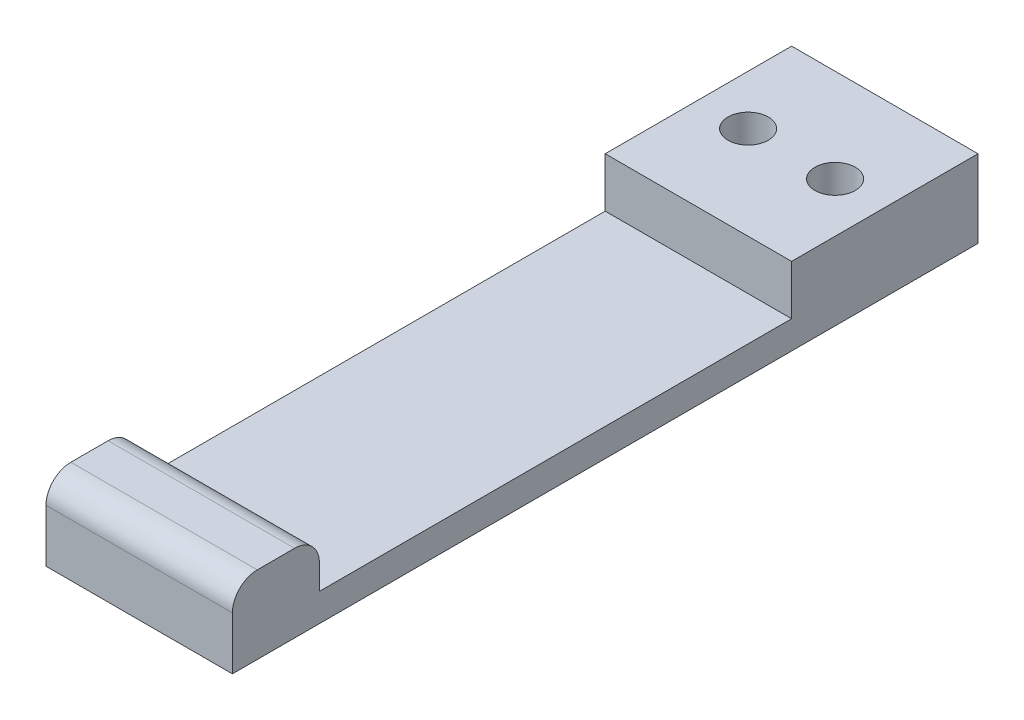
ISO-10303-21;
HEADER;
FILE_DESCRIPTION(('STEP AP214'),'2;1');
FILE_NAME('part.step','',(''),(''),'','','');
FILE_SCHEMA(('AUTOMOTIVE_DESIGN { 1 0 10303 214 1 1 1 1 }'));
ENDSEC;
DATA;
#1=APPLICATION_CONTEXT('core data for automotive mechanical design processes');
#2=APPLICATION_PROTOCOL_DEFINITION('international standard','automotive_design',2000,#1);
#3=PRODUCT_CONTEXT('',#1,'mechanical');
#4=PRODUCT('Part','Part','',(#3));
#5=PRODUCT_RELATED_PRODUCT_CATEGORY('part','',(#4));
#6=PRODUCT_DEFINITION_FORMATION('','',#4);
#7=PRODUCT_DEFINITION_CONTEXT('part definition',#1,'design');
#8=PRODUCT_DEFINITION('design','',#6,#7);
#9=PRODUCT_DEFINITION_SHAPE('','',#8);
#10=(LENGTH_UNIT() NAMED_UNIT(*) SI_UNIT(.MILLI.,.METRE.));
#11=(NAMED_UNIT(*) PLANE_ANGLE_UNIT() SI_UNIT($,.RADIAN.));
#12=(NAMED_UNIT(*) SI_UNIT($,.STERADIAN.) SOLID_ANGLE_UNIT());
#13=UNCERTAINTY_MEASURE_WITH_UNIT(LENGTH_MEASURE(1.E-05),#10,'distance_accuracy_value','');
#14=(GEOMETRIC_REPRESENTATION_CONTEXT(3) GLOBAL_UNCERTAINTY_ASSIGNED_CONTEXT((#13)) GLOBAL_UNIT_ASSIGNED_CONTEXT((#10,
#11,#12)) REPRESENTATION_CONTEXT('',''));
#15=CARTESIAN_POINT('',(0.,0.,0.));
#16=DIRECTION('',(0.,0.,1.));
#17=DIRECTION('',(1.,0.,0.));
#18=AXIS2_PLACEMENT_3D('',#15,#16,#17);
#19=CARTESIAN_POINT('',(15.,0.,-60.));
#20=DIRECTION('',(0.,0.,-1.));
#21=DIRECTION('',(-1.,0.,0.));
#22=AXIS2_PLACEMENT_3D('',#19,#20,#21);
#23=PLANE('',#22);
#24=DIRECTION('',(0.,-1.,0.));
#25=VECTOR('',#24,1.);
#26=CARTESIAN_POINT('',(0.,0.,-60.));
#27=LINE('',#26,#25);
#28=CARTESIAN_POINT('',(0.,6.25,-60.));
#29=VERTEX_POINT('',#28);
#30=CARTESIAN_POINT('',(0.,0.,-60.));
#31=VERTEX_POINT('',#30);
#32=EDGE_CURVE('E160',#29,#31,#27,.T.);
#33=ORIENTED_EDGE('',*,*,#32,.F.);
#34=DIRECTION('',(-1.,0.,0.));
#35=VECTOR('',#34,1.);
#36=CARTESIAN_POINT('',(15.,6.25,-60.));
#37=LINE('',#36,#35);
#38=CARTESIAN_POINT('',(15.,6.25,-60.));
#39=VERTEX_POINT('',#38);
#40=EDGE_CURVE('E11',#39,#29,#37,.T.);
#41=ORIENTED_EDGE('',*,*,#40,.F.);
#42=DIRECTION('',(0.,-1.,0.));
#43=VECTOR('',#42,1.);
#44=CARTESIAN_POINT('',(15.,0.,-60.));
#45=LINE('',#44,#43);
#46=CARTESIAN_POINT('',(15.,0.,-60.));
#47=VERTEX_POINT('',#46);
#48=EDGE_CURVE('E196',#39,#47,#45,.T.);
#49=ORIENTED_EDGE('',*,*,#48,.T.);
#50=DIRECTION('',(-1.,0.,0.));
#51=VECTOR('',#50,1.);
#52=CARTESIAN_POINT('',(15.,0.,-60.));
#53=LINE('',#52,#51);
#54=EDGE_CURVE('E104',#47,#31,#53,.T.);
#55=ORIENTED_EDGE('',*,*,#54,.T.);
#56=EDGE_LOOP('',(#33,#41,#49,#55));
#57=FACE_BOUND('',#56,.T.);
#58=ADVANCED_FACE('F47',(#57),#23,.T.);
#59=CARTESIAN_POINT('',(15.,6.24999999999999,0.));
#60=DIRECTION('',(0.,-1.,0.));
#61=DIRECTION('',(0.,0.,-1.));
#62=AXIS2_PLACEMENT_3D('',#59,#60,#61);
#63=PLANE('',#62);
#64=CARTESIAN_POINT('',(11.,6.25,-52.5));
#65=DIRECTION('',(0.,-1.,0.));
#66=DIRECTION('',(0.,0.,-1.));
#67=AXIS2_PLACEMENT_3D('',#64,#65,#66);
#68=CIRCLE('',#67,1.625);
#69=CARTESIAN_POINT('',(11.,6.25,-54.125));
#70=VERTEX_POINT('',#69);
#71=EDGE_CURVE('E165',#70,#70,#68,.F.);
#72=ORIENTED_EDGE('',*,*,#71,.F.);
#73=EDGE_LOOP('',(#72));
#74=FACE_BOUND('',#73,.T.);
#75=CARTESIAN_POINT('',(4.,6.25,-52.5));
#76=DIRECTION('',(0.,-1.,0.));
#77=DIRECTION('',(0.,0.,-1.));
#78=AXIS2_PLACEMENT_3D('',#75,#76,#77);
#79=CIRCLE('',#78,1.625);
#80=CARTESIAN_POINT('',(4.,6.25,-54.125));
#81=VERTEX_POINT('',#80);
#82=EDGE_CURVE('E265',#81,#81,#79,.F.);
#83=ORIENTED_EDGE('',*,*,#82,.F.);
#84=EDGE_LOOP('',(#83));
#85=FACE_BOUND('',#84,.T.);
#86=DIRECTION('',(0.,0.,1.));
#87=VECTOR('',#86,1.);
#88=CARTESIAN_POINT('',(0.,6.24999999999999,0.));
#89=LINE('',#88,#87);
#90=CARTESIAN_POINT('',(0.,6.25,-45.));
#91=VERTEX_POINT('',#90);
#92=EDGE_CURVE('E164',#29,#91,#89,.T.);
#93=ORIENTED_EDGE('',*,*,#92,.T.);
#94=DIRECTION('',(-1.,0.,0.));
#95=VECTOR('',#94,1.);
#96=CARTESIAN_POINT('',(15.,6.25,-45.));
#97=LINE('',#96,#95);
#98=CARTESIAN_POINT('',(15.,6.25,-45.));
#99=VERTEX_POINT('',#98);
#100=EDGE_CURVE('E56',#99,#91,#97,.T.);
#101=ORIENTED_EDGE('',*,*,#100,.F.);
#102=DIRECTION('',(0.,0.,1.));
#103=VECTOR('',#102,1.);
#104=CARTESIAN_POINT('',(15.,6.24999999999999,0.));
#105=LINE('',#104,#103);
#106=EDGE_CURVE('E235',#39,#99,#105,.T.);
#107=ORIENTED_EDGE('',*,*,#106,.F.);
#108=ORIENTED_EDGE('',*,*,#40,.T.);
#109=EDGE_LOOP('',(#93,#101,#107,#108));
#110=FACE_BOUND('',#109,.T.);
#111=ADVANCED_FACE('F224',(#74,#85,#110),#63,.F.);
#112=CARTESIAN_POINT('',(15.,0.,-45.));
#113=DIRECTION('',(0.,0.,1.));
#114=DIRECTION('',(1.,0.,0.));
#115=AXIS2_PLACEMENT_3D('',#112,#113,#114);
#116=PLANE('',#115);
#117=DIRECTION('',(0.,1.,0.));
#118=VECTOR('',#117,1.);
#119=CARTESIAN_POINT('',(0.,0.,-45.));
#120=LINE('',#119,#118);
#121=CARTESIAN_POINT('',(0.,2.25,-45.));
#122=VERTEX_POINT('',#121);
#123=EDGE_CURVE('E169',#122,#91,#120,.T.);
#124=ORIENTED_EDGE('',*,*,#123,.F.);
#125=DIRECTION('',(-1.,0.,0.));
#126=VECTOR('',#125,1.);
#127=CARTESIAN_POINT('',(15.,2.25,-45.));
#128=LINE('',#127,#126);
#129=CARTESIAN_POINT('',(15.,2.25,-45.));
#130=VERTEX_POINT('',#129);
#131=EDGE_CURVE('E212',#130,#122,#128,.T.);
#132=ORIENTED_EDGE('',*,*,#131,.F.);
#133=DIRECTION('',(0.,1.,0.));
#134=VECTOR('',#133,1.);
#135=CARTESIAN_POINT('',(15.,0.,-45.));
#136=LINE('',#135,#134);
#137=EDGE_CURVE('E221',#130,#99,#136,.T.);
#138=ORIENTED_EDGE('',*,*,#137,.T.);
#139=ORIENTED_EDGE('',*,*,#100,.T.);
#140=EDGE_LOOP('',(#124,#132,#138,#139));
#141=FACE_BOUND('',#140,.T.);
#142=ADVANCED_FACE('F219',(#141),#116,.T.);
#143=CARTESIAN_POINT('',(15.,2.25,0.));
#144=DIRECTION('',(0.,1.,0.));
#145=DIRECTION('',(0.,0.,1.));
#146=AXIS2_PLACEMENT_3D('',#143,#144,#145);
#147=PLANE('',#146);
#148=DIRECTION('',(0.,0.,-1.));
#149=VECTOR('',#148,1.);
#150=CARTESIAN_POINT('',(0.,2.25,0.));
#151=LINE('',#150,#149);
#152=CARTESIAN_POINT('',(0.,2.25,-7.));
#153=VERTEX_POINT('',#152);
#154=EDGE_CURVE('E173',#153,#122,#151,.T.);
#155=ORIENTED_EDGE('',*,*,#154,.F.);
#156=DIRECTION('',(-1.,0.,0.));
#157=VECTOR('',#156,1.);
#158=CARTESIAN_POINT('',(15.,2.25,-7.));
#159=LINE('',#158,#157);
#160=CARTESIAN_POINT('',(15.,2.25,-7.));
#161=VERTEX_POINT('',#160);
#162=EDGE_CURVE('E209',#161,#153,#159,.T.);
#163=ORIENTED_EDGE('',*,*,#162,.F.);
#164=DIRECTION('',(0.,0.,-1.));
#165=VECTOR('',#164,1.);
#166=CARTESIAN_POINT('',(15.,2.25,0.));
#167=LINE('',#166,#165);
#168=EDGE_CURVE('E234',#161,#130,#167,.T.);
#169=ORIENTED_EDGE('',*,*,#168,.T.);
#170=ORIENTED_EDGE('',*,*,#131,.T.);
#171=EDGE_LOOP('',(#155,#163,#169,#170));
#172=FACE_BOUND('',#171,.T.);
#173=ADVANCED_FACE('F230',(#172),#147,.T.);
#174=CARTESIAN_POINT('',(15.,0.,-7.));
#175=DIRECTION('',(0.,0.,1.));
#176=DIRECTION('',(0.,-1.,0.));
#177=AXIS2_PLACEMENT_3D('',#174,#175,#176);
#178=PLANE('',#177);
#179=DIRECTION('',(0.,1.,0.));
#180=VECTOR('',#179,1.);
#181=CARTESIAN_POINT('',(0.,0.,-7.));
#182=LINE('',#181,#180);
#183=CARTESIAN_POINT('',(0.,4.25,-7.));
#184=VERTEX_POINT('',#183);
#185=EDGE_CURVE('E177',#153,#184,#182,.T.);
#186=ORIENTED_EDGE('',*,*,#185,.T.);
#187=DIRECTION('',(-1.,0.,0.));
#188=VECTOR('',#187,1.);
#189=CARTESIAN_POINT('',(15.,4.25,-7.));
#190=LINE('',#189,#188);
#191=CARTESIAN_POINT('',(15.,4.25,-7.));
#192=VERTEX_POINT('',#191);
#193=EDGE_CURVE('E206',#192,#184,#190,.T.);
#194=ORIENTED_EDGE('',*,*,#193,.F.);
#195=DIRECTION('',(0.,1.,0.));
#196=VECTOR('',#195,1.);
#197=CARTESIAN_POINT('',(15.,0.,-7.));
#198=LINE('',#197,#196);
#199=EDGE_CURVE('E240',#161,#192,#198,.T.);
#200=ORIENTED_EDGE('',*,*,#199,.F.);
#201=ORIENTED_EDGE('',*,*,#162,.T.);
#202=EDGE_LOOP('',(#186,#194,#200,#201));
#203=FACE_BOUND('',#202,.T.);
#204=ADVANCED_FACE('F309',(#203),#178,.F.);
#205=CARTESIAN_POINT('',(15.,4.25,-5.));
#206=DIRECTION('',(-1.,0.,0.));
#207=DIRECTION('',(0.,0.,1.));
#208=AXIS2_PLACEMENT_3D('',#205,#206,#207);
#209=CYLINDRICAL_SURFACE('',#208,2.);
#210=CARTESIAN_POINT('',(0.,4.25,-5.));
#211=DIRECTION('',(1.,0.,0.));
#212=DIRECTION('',(0.,0.,-1.));
#213=AXIS2_PLACEMENT_3D('',#210,#211,#212);
#214=CIRCLE('',#213,2.);
#215=CARTESIAN_POINT('',(0.,6.25,-5.));
#216=VERTEX_POINT('',#215);
#217=EDGE_CURVE('E181',#216,#184,#214,.F.);
#218=ORIENTED_EDGE('',*,*,#217,.F.);
#219=DIRECTION('',(-1.,0.,0.));
#220=VECTOR('',#219,1.);
#221=CARTESIAN_POINT('',(15.,6.25,-5.));
#222=LINE('',#221,#220);
#223=CARTESIAN_POINT('',(15.,6.25,-5.));
#224=VERTEX_POINT('',#223);
#225=EDGE_CURVE('E203',#224,#216,#222,.T.);
#226=ORIENTED_EDGE('',*,*,#225,.F.);
#227=CARTESIAN_POINT('',(15.,4.25,-5.));
#228=DIRECTION('',(1.,0.,0.));
#229=DIRECTION('',(0.,0.,-1.));
#230=AXIS2_PLACEMENT_3D('',#227,#228,#229);
#231=CIRCLE('',#230,2.);
#232=EDGE_CURVE('E154',#224,#192,#231,.F.);
#233=ORIENTED_EDGE('',*,*,#232,.T.);
#234=ORIENTED_EDGE('',*,*,#193,.T.);
#235=EDGE_LOOP('',(#218,#226,#233,#234));
#236=FACE_BOUND('',#235,.T.);
#237=ADVANCED_FACE('F250',(#236),#209,.T.);
#238=CARTESIAN_POINT('',(15.,6.25,0.));
#239=DIRECTION('',(0.,1.,0.));
#240=DIRECTION('',(0.,0.,1.));
#241=AXIS2_PLACEMENT_3D('',#238,#239,#240);
#242=PLANE('',#241);
#243=DIRECTION('',(0.,0.,-1.));
#244=VECTOR('',#243,1.);
#245=CARTESIAN_POINT('',(0.,6.25,0.));
#246=LINE('',#245,#244);
#247=CARTESIAN_POINT('',(0.,6.25,-2.));
#248=VERTEX_POINT('',#247);
#249=EDGE_CURVE('E185',#248,#216,#246,.T.);
#250=ORIENTED_EDGE('',*,*,#249,.F.);
#251=DIRECTION('',(-1.,0.,0.));
#252=VECTOR('',#251,1.);
#253=CARTESIAN_POINT('',(15.,6.25,-2.));
#254=LINE('',#253,#252);
#255=CARTESIAN_POINT('',(15.,6.25,-2.));
#256=VERTEX_POINT('',#255);
#257=EDGE_CURVE('E139',#256,#248,#254,.T.);
#258=ORIENTED_EDGE('',*,*,#257,.F.);
#259=DIRECTION('',(0.,0.,-1.));
#260=VECTOR('',#259,1.);
#261=CARTESIAN_POINT('',(15.,6.25,0.));
#262=LINE('',#261,#260);
#263=EDGE_CURVE('E150',#256,#224,#262,.T.);
#264=ORIENTED_EDGE('',*,*,#263,.T.);
#265=ORIENTED_EDGE('',*,*,#225,.T.);
#266=EDGE_LOOP('',(#250,#258,#264,#265));
#267=FACE_BOUND('',#266,.T.);
#268=ADVANCED_FACE('F254',(#267),#242,.T.);
#269=CARTESIAN_POINT('',(15.,4.25,-2.));
#270=DIRECTION('',(-1.,0.,0.));
#271=DIRECTION('',(0.,0.,1.));
#272=AXIS2_PLACEMENT_3D('',#269,#270,#271);
#273=CYLINDRICAL_SURFACE('',#272,2.);
#274=CARTESIAN_POINT('',(0.,4.25,-2.));
#275=DIRECTION('',(1.,0.,0.));
#276=DIRECTION('',(0.,0.,-1.));
#277=AXIS2_PLACEMENT_3D('',#274,#275,#276);
#278=CIRCLE('',#277,2.);
#279=CARTESIAN_POINT('',(0.,4.25,0.));
#280=VERTEX_POINT('',#279);
#281=EDGE_CURVE('E137',#280,#248,#278,.F.);
#282=ORIENTED_EDGE('',*,*,#281,.F.);
#283=DIRECTION('',(-1.,0.,0.));
#284=VECTOR('',#283,1.);
#285=CARTESIAN_POINT('',(15.,4.25,0.));
#286=LINE('',#285,#284);
#287=CARTESIAN_POINT('',(15.,4.25,0.));
#288=VERTEX_POINT('',#287);
#289=EDGE_CURVE('E131',#288,#280,#286,.T.);
#290=ORIENTED_EDGE('',*,*,#289,.F.);
#291=CARTESIAN_POINT('',(15.,4.25,-2.));
#292=DIRECTION('',(1.,0.,0.));
#293=DIRECTION('',(0.,0.,-1.));
#294=AXIS2_PLACEMENT_3D('',#291,#292,#293);
#295=CIRCLE('',#294,2.);
#296=EDGE_CURVE('E135',#288,#256,#295,.F.);
#297=ORIENTED_EDGE('',*,*,#296,.T.);
#298=ORIENTED_EDGE('',*,*,#257,.T.);
#299=EDGE_LOOP('',(#282,#290,#297,#298));
#300=FACE_BOUND('',#299,.T.);
#301=ADVANCED_FACE('F133',(#300),#273,.T.);
#302=CARTESIAN_POINT('',(15.,0.,0.));
#303=DIRECTION('',(0.,0.,-1.));
#304=DIRECTION('',(0.,1.,0.));
#305=AXIS2_PLACEMENT_3D('',#302,#303,#304);
#306=PLANE('',#305);
#307=DIRECTION('',(0.,-1.,0.));
#308=VECTOR('',#307,1.);
#309=CARTESIAN_POINT('',(0.,0.,0.));
#310=LINE('',#309,#308);
#311=CARTESIAN_POINT('',(0.,0.,0.));
#312=VERTEX_POINT('',#311);
#313=EDGE_CURVE('E97',#280,#312,#310,.T.);
#314=ORIENTED_EDGE('',*,*,#313,.T.);
#315=DIRECTION('',(-1.,0.,0.));
#316=VECTOR('',#315,1.);
#317=CARTESIAN_POINT('',(15.,0.,0.));
#318=LINE('',#317,#316);
#319=CARTESIAN_POINT('',(15.,0.,0.));
#320=VERTEX_POINT('',#319);
#321=EDGE_CURVE('E140',#320,#312,#318,.T.);
#322=ORIENTED_EDGE('',*,*,#321,.F.);
#323=DIRECTION('',(0.,-1.,0.));
#324=VECTOR('',#323,1.);
#325=CARTESIAN_POINT('',(15.,0.,0.));
#326=LINE('',#325,#324);
#327=EDGE_CURVE('E142',#288,#320,#326,.T.);
#328=ORIENTED_EDGE('',*,*,#327,.F.);
#329=ORIENTED_EDGE('',*,*,#289,.T.);
#330=EDGE_LOOP('',(#314,#322,#328,#329));
#331=FACE_BOUND('',#330,.T.);
#332=ADVANCED_FACE('F143',(#331),#306,.F.);
#333=CARTESIAN_POINT('',(15.,0.,0.));
#334=DIRECTION('',(0.,1.,0.));
#335=DIRECTION('',(0.,0.,1.));
#336=AXIS2_PLACEMENT_3D('',#333,#334,#335);
#337=PLANE('',#336);
#338=CARTESIAN_POINT('',(11.,0.,-52.5));
#339=DIRECTION('',(0.,-1.,0.));
#340=DIRECTION('',(0.,0.,-1.));
#341=AXIS2_PLACEMENT_3D('',#338,#339,#340);
#342=CIRCLE('',#341,1.625);
#343=CARTESIAN_POINT('',(11.,0.,-54.125));
#344=VERTEX_POINT('',#343);
#345=EDGE_CURVE('E264',#344,#344,#342,.T.);
#346=ORIENTED_EDGE('',*,*,#345,.F.);
#347=EDGE_LOOP('',(#346));
#348=FACE_BOUND('',#347,.T.);
#349=CARTESIAN_POINT('',(4.,0.,-52.5));
#350=DIRECTION('',(0.,-1.,0.));
#351=DIRECTION('',(0.,0.,-1.));
#352=AXIS2_PLACEMENT_3D('',#349,#350,#351);
#353=CIRCLE('',#352,1.625);
#354=CARTESIAN_POINT('',(4.,0.,-54.125));
#355=VERTEX_POINT('',#354);
#356=EDGE_CURVE('E260',#355,#355,#353,.T.);
#357=ORIENTED_EDGE('',*,*,#356,.F.);
#358=EDGE_LOOP('',(#357));
#359=FACE_BOUND('',#358,.T.);
#360=DIRECTION('',(0.,0.,-1.));
#361=VECTOR('',#360,1.);
#362=CARTESIAN_POINT('',(0.,0.,0.));
#363=LINE('',#362,#361);
#364=EDGE_CURVE('E193',#312,#31,#363,.T.);
#365=ORIENTED_EDGE('',*,*,#364,.T.);
#366=ORIENTED_EDGE('',*,*,#54,.F.);
#367=DIRECTION('',(0.,0.,-1.));
#368=VECTOR('',#367,1.);
#369=CARTESIAN_POINT('',(15.,0.,0.));
#370=LINE('',#369,#368);
#371=EDGE_CURVE('E64',#320,#47,#370,.T.);
#372=ORIENTED_EDGE('',*,*,#371,.F.);
#373=ORIENTED_EDGE('',*,*,#321,.T.);
#374=EDGE_LOOP('',(#365,#366,#372,#373));
#375=FACE_BOUND('',#374,.T.);
#376=ADVANCED_FACE('F257',(#348,#359,#375),#337,.F.);
#377=CARTESIAN_POINT('',(15.,0.,0.));
#378=DIRECTION('',(1.,0.,0.));
#379=DIRECTION('',(0.,0.,-1.));
#380=AXIS2_PLACEMENT_3D('',#377,#378,#379);
#381=PLANE('',#380);
#382=ORIENTED_EDGE('',*,*,#48,.F.);
#383=ORIENTED_EDGE('',*,*,#106,.T.);
#384=ORIENTED_EDGE('',*,*,#137,.F.);
#385=ORIENTED_EDGE('',*,*,#168,.F.);
#386=ORIENTED_EDGE('',*,*,#199,.T.);
#387=ORIENTED_EDGE('',*,*,#232,.F.);
#388=ORIENTED_EDGE('',*,*,#263,.F.);
#389=ORIENTED_EDGE('',*,*,#296,.F.);
#390=ORIENTED_EDGE('',*,*,#327,.T.);
#391=ORIENTED_EDGE('',*,*,#371,.T.);
#392=EDGE_LOOP('',(#382,#383,#384,#385,#386,#387,#388,#389,#390,#391));
#393=FACE_BOUND('',#392,.T.);
#394=ADVANCED_FACE('F147',(#393),#381,.T.);
#395=CARTESIAN_POINT('',(0.,0.,0.));
#396=DIRECTION('',(1.,0.,0.));
#397=DIRECTION('',(0.,0.,-1.));
#398=AXIS2_PLACEMENT_3D('',#395,#396,#397);
#399=PLANE('',#398);
#400=ORIENTED_EDGE('',*,*,#32,.T.);
#401=ORIENTED_EDGE('',*,*,#364,.F.);
#402=ORIENTED_EDGE('',*,*,#313,.F.);
#403=ORIENTED_EDGE('',*,*,#281,.T.);
#404=ORIENTED_EDGE('',*,*,#249,.T.);
#405=ORIENTED_EDGE('',*,*,#217,.T.);
#406=ORIENTED_EDGE('',*,*,#185,.F.);
#407=ORIENTED_EDGE('',*,*,#154,.T.);
#408=ORIENTED_EDGE('',*,*,#123,.T.);
#409=ORIENTED_EDGE('',*,*,#92,.F.);
#410=EDGE_LOOP('',(#400,#401,#402,#403,#404,#405,#406,#407,#408,#409));
#411=FACE_BOUND('',#410,.T.);
#412=ADVANCED_FACE('F226',(#411),#399,.F.);
#413=CARTESIAN_POINT('',(4.,10.8461940777126,-52.5));
#414=DIRECTION('',(0.,-1.,0.));
#415=DIRECTION('',(0.,0.,-1.));
#416=AXIS2_PLACEMENT_3D('',#413,#414,#415);
#417=CYLINDRICAL_SURFACE('',#416,1.625);
#418=ORIENTED_EDGE('',*,*,#82,.T.);
#419=EDGE_LOOP('',(#418));
#420=FACE_BOUND('',#419,.T.);
#421=ORIENTED_EDGE('',*,*,#356,.T.);
#422=EDGE_LOOP('',(#421));
#423=FACE_BOUND('',#422,.T.);
#424=ADVANCED_FACE('F283',(#420,#423),#417,.F.);
#425=CARTESIAN_POINT('',(11.,10.8461940777126,-52.5));
#426=DIRECTION('',(0.,-1.,0.));
#427=DIRECTION('',(0.,0.,-1.));
#428=AXIS2_PLACEMENT_3D('',#425,#426,#427);
#429=CYLINDRICAL_SURFACE('',#428,1.625);
#430=ORIENTED_EDGE('',*,*,#71,.T.);
#431=EDGE_LOOP('',(#430));
#432=FACE_BOUND('',#431,.T.);
#433=ORIENTED_EDGE('',*,*,#345,.T.);
#434=EDGE_LOOP('',(#433));
#435=FACE_BOUND('',#434,.T.);
#436=ADVANCED_FACE('F276',(#432,#435),#429,.F.);
#437=CLOSED_SHELL('',(#58,#111,#142,#173,#204,#237,#268,#301,#332,#376,#394,#412,#424,#436));
#438=MANIFOLD_SOLID_BREP('B2',#437);
#439=ADVANCED_BREP_SHAPE_REPRESENTATION('',(#18,#438),#14);
#440=SHAPE_DEFINITION_REPRESENTATION(#9,#439);
ENDSEC;
END-ISO-10303-21;
